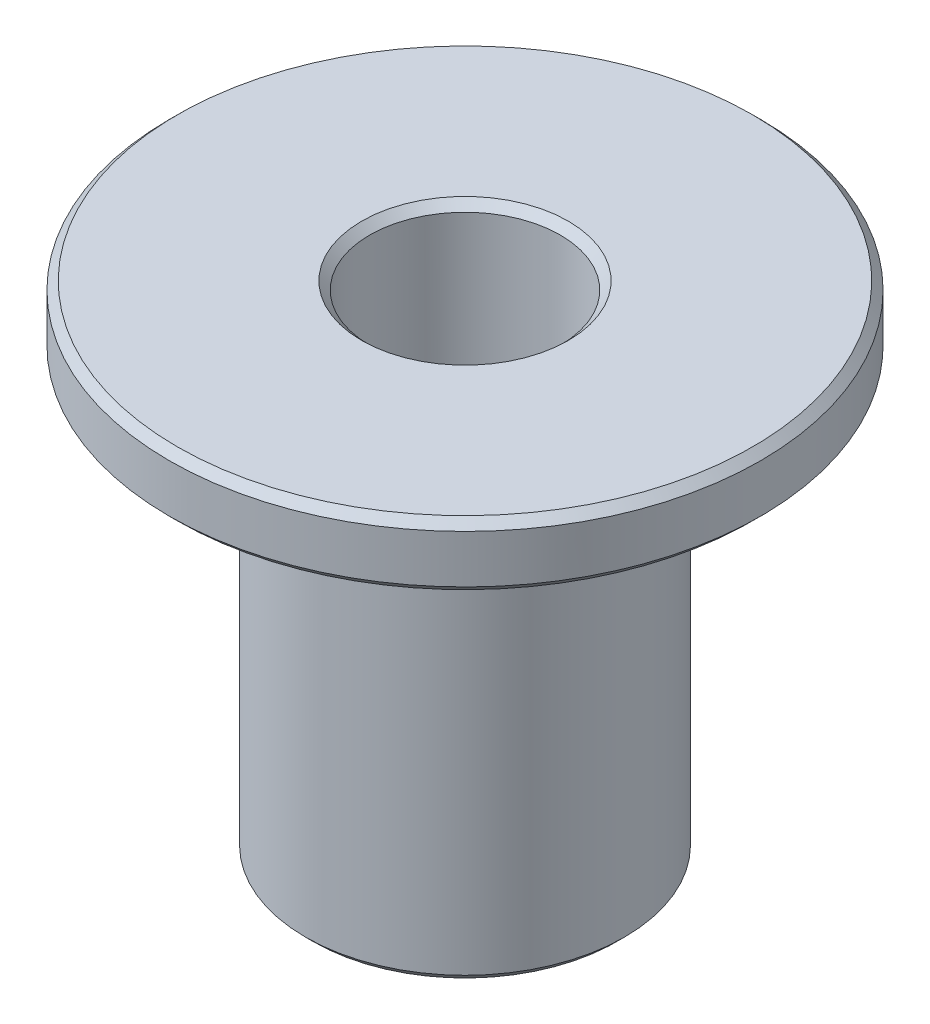
ISO-10303-21;
HEADER;
FILE_DESCRIPTION(('STEP AP214'),'2;1');
FILE_NAME('part.step','',(''),(''),'','','');
FILE_SCHEMA(('AUTOMOTIVE_DESIGN { 1 0 10303 214 1 1 1 1 }'));
ENDSEC;
DATA;
#1=APPLICATION_CONTEXT('core data for automotive mechanical design processes');
#2=APPLICATION_PROTOCOL_DEFINITION('international standard','automotive_design',2000,#1);
#3=PRODUCT_CONTEXT('',#1,'mechanical');
#4=PRODUCT('Part','Part','',(#3));
#5=PRODUCT_RELATED_PRODUCT_CATEGORY('part','',(#4));
#6=PRODUCT_DEFINITION_FORMATION('','',#4);
#7=PRODUCT_DEFINITION_CONTEXT('part definition',#1,'design');
#8=PRODUCT_DEFINITION('design','',#6,#7);
#9=PRODUCT_DEFINITION_SHAPE('','',#8);
#10=(LENGTH_UNIT() NAMED_UNIT(*) SI_UNIT(.MILLI.,.METRE.));
#11=(NAMED_UNIT(*) PLANE_ANGLE_UNIT() SI_UNIT($,.RADIAN.));
#12=(NAMED_UNIT(*) SI_UNIT($,.STERADIAN.) SOLID_ANGLE_UNIT());
#13=UNCERTAINTY_MEASURE_WITH_UNIT(LENGTH_MEASURE(1.E-05),#10,'distance_accuracy_value','');
#14=(GEOMETRIC_REPRESENTATION_CONTEXT(3) GLOBAL_UNCERTAINTY_ASSIGNED_CONTEXT((#13)) GLOBAL_UNIT_ASSIGNED_CONTEXT((#10,
#11,#12)) REPRESENTATION_CONTEXT('',''));
#15=CARTESIAN_POINT('',(0.,0.,0.));
#16=DIRECTION('',(0.,0.,1.));
#17=DIRECTION('',(1.,0.,0.));
#18=AXIS2_PLACEMENT_3D('',#15,#16,#17);
#19=CARTESIAN_POINT('',(4.975,14.5,0.));
#20=DIRECTION('',(0.,1.,0.));
#21=DIRECTION('',(0.,0.,1.));
#22=AXIS2_PLACEMENT_3D('',#19,#20,#21);
#23=PLANE('',#22);
#24=CARTESIAN_POINT('',(0.,14.5,0.));
#25=DIRECTION('',(0.,1.,0.));
#26=DIRECTION('',(0.,0.,1.));
#27=AXIS2_PLACEMENT_3D('',#24,#25,#26);
#28=CIRCLE('',#27,3.225);
#29=CARTESIAN_POINT('',(0.,14.5,3.225));
#30=VERTEX_POINT('',#29);
#31=EDGE_CURVE('E62',#30,#30,#28,.T.);
#32=ORIENTED_EDGE('',*,*,#31,.T.);
#33=EDGE_LOOP('',(#32));
#34=FACE_BOUND('',#33,.T.);
#35=CARTESIAN_POINT('',(0.,14.5,0.));
#36=DIRECTION('',(0.,1.,0.));
#37=DIRECTION('',(0.,0.,1.));
#38=AXIS2_PLACEMENT_3D('',#35,#36,#37);
#39=CIRCLE('',#38,4.725);
#40=CARTESIAN_POINT('',(0.,14.5,4.725));
#41=VERTEX_POINT('',#40);
#42=EDGE_CURVE('E65',#41,#41,#39,.F.);
#43=ORIENTED_EDGE('',*,*,#42,.T.);
#44=EDGE_LOOP('',(#43));
#45=FACE_BOUND('',#44,.T.);
#46=ADVANCED_FACE('F31',(#34,#45),#23,.F.);
#47=CARTESIAN_POINT('',(0.,30.,0.));
#48=DIRECTION('',(0.,1.,0.));
#49=DIRECTION('',(0.,0.,1.));
#50=AXIS2_PLACEMENT_3D('',#47,#48,#49);
#51=CYLINDRICAL_SURFACE('',#50,2.975);
#52=CARTESIAN_POINT('',(0.,14.75,0.));
#53=DIRECTION('',(0.,1.,0.));
#54=DIRECTION('',(0.,0.,1.));
#55=AXIS2_PLACEMENT_3D('',#52,#53,#54);
#56=CIRCLE('',#55,2.975);
#57=CARTESIAN_POINT('',(0.,14.75,2.975));
#58=VERTEX_POINT('',#57);
#59=EDGE_CURVE('E56',#58,#58,#56,.F.);
#60=ORIENTED_EDGE('',*,*,#59,.T.);
#61=EDGE_LOOP('',(#60));
#62=FACE_BOUND('',#61,.T.);
#63=CARTESIAN_POINT('',(0.,29.75,0.));
#64=DIRECTION('',(0.,-1.,0.));
#65=DIRECTION('',(0.,0.,-1.));
#66=AXIS2_PLACEMENT_3D('',#63,#64,#65);
#67=CIRCLE('',#66,2.975);
#68=CARTESIAN_POINT('',(0.,29.75,-2.975));
#69=VERTEX_POINT('',#68);
#70=EDGE_CURVE('E59',#69,#69,#67,.F.);
#71=ORIENTED_EDGE('',*,*,#70,.T.);
#72=EDGE_LOOP('',(#71));
#73=FACE_BOUND('',#72,.T.);
#74=ADVANCED_FACE('F88',(#62,#73),#51,.F.);
#75=CARTESIAN_POINT('',(2.975,30.,0.));
#76=DIRECTION('',(0.,-1.,0.));
#77=DIRECTION('',(0.,0.,-1.));
#78=AXIS2_PLACEMENT_3D('',#75,#76,#77);
#79=PLANE('',#78);
#80=CARTESIAN_POINT('',(0.,30.,0.));
#81=DIRECTION('',(0.,-1.,0.));
#82=DIRECTION('',(0.,0.,-1.));
#83=AXIS2_PLACEMENT_3D('',#80,#81,#82);
#84=CIRCLE('',#83,3.225);
#85=CARTESIAN_POINT('',(0.,30.,-3.225));
#86=VERTEX_POINT('',#85);
#87=EDGE_CURVE('E50',#86,#86,#84,.T.);
#88=ORIENTED_EDGE('',*,*,#87,.T.);
#89=EDGE_LOOP('',(#88));
#90=FACE_BOUND('',#89,.T.);
#91=CARTESIAN_POINT('',(0.,30.,0.));
#92=DIRECTION('',(0.,-1.,0.));
#93=DIRECTION('',(0.,0.,-1.));
#94=AXIS2_PLACEMENT_3D('',#91,#92,#93);
#95=CIRCLE('',#94,8.975);
#96=CARTESIAN_POINT('',(0.,30.,-8.975));
#97=VERTEX_POINT('',#96);
#98=EDGE_CURVE('E53',#97,#97,#95,.F.);
#99=ORIENTED_EDGE('',*,*,#98,.T.);
#100=EDGE_LOOP('',(#99));
#101=FACE_BOUND('',#100,.T.);
#102=ADVANCED_FACE('F93',(#90,#101),#79,.F.);
#103=CARTESIAN_POINT('',(0.,30.,0.));
#104=DIRECTION('',(0.,1.,0.));
#105=DIRECTION('',(0.,0.,1.));
#106=AXIS2_PLACEMENT_3D('',#103,#104,#105);
#107=CYLINDRICAL_SURFACE('',#106,9.225);
#108=CARTESIAN_POINT('',(0.,29.75,0.));
#109=DIRECTION('',(0.,-1.,0.));
#110=DIRECTION('',(0.,0.,-1.));
#111=AXIS2_PLACEMENT_3D('',#108,#109,#110);
#112=CIRCLE('',#111,9.225);
#113=CARTESIAN_POINT('',(0.,29.75,-9.225));
#114=VERTEX_POINT('',#113);
#115=EDGE_CURVE('E41',#114,#114,#112,.T.);
#116=ORIENTED_EDGE('',*,*,#115,.T.);
#117=EDGE_LOOP('',(#116));
#118=FACE_BOUND('',#117,.T.);
#119=CARTESIAN_POINT('',(0.,28.25,0.));
#120=DIRECTION('',(0.,1.,0.));
#121=DIRECTION('',(0.,0.,1.));
#122=AXIS2_PLACEMENT_3D('',#119,#120,#121);
#123=CIRCLE('',#122,9.225);
#124=CARTESIAN_POINT('',(0.,28.25,9.225));
#125=VERTEX_POINT('',#124);
#126=EDGE_CURVE('E45',#125,#125,#123,.T.);
#127=ORIENTED_EDGE('',*,*,#126,.T.);
#128=EDGE_LOOP('',(#127));
#129=FACE_BOUND('',#128,.T.);
#130=ADVANCED_FACE('F85',(#118,#129),#107,.T.);
#131=CARTESIAN_POINT('',(9.225,28.,0.));
#132=DIRECTION('',(0.,1.,0.));
#133=DIRECTION('',(0.,0.,1.));
#134=AXIS2_PLACEMENT_3D('',#131,#132,#133);
#135=PLANE('',#134);
#136=CARTESIAN_POINT('',(0.,28.,0.));
#137=DIRECTION('',(0.,1.,0.));
#138=DIRECTION('',(0.,0.,1.));
#139=AXIS2_PLACEMENT_3D('',#136,#137,#138);
#140=CIRCLE('',#139,8.975);
#141=CARTESIAN_POINT('',(0.,28.,8.975));
#142=VERTEX_POINT('',#141);
#143=EDGE_CURVE('E37',#142,#142,#140,.F.);
#144=ORIENTED_EDGE('',*,*,#143,.T.);
#145=EDGE_LOOP('',(#144));
#146=FACE_BOUND('',#145,.T.);
#147=CARTESIAN_POINT('',(0.,28.,0.));
#148=DIRECTION('',(0.,1.,0.));
#149=DIRECTION('',(0.,0.,1.));
#150=AXIS2_PLACEMENT_3D('',#147,#148,#149);
#151=CIRCLE('',#150,4.975);
#152=CARTESIAN_POINT('',(0.,28.,4.975));
#153=VERTEX_POINT('',#152);
#154=EDGE_CURVE('E68',#153,#153,#151,.T.);
#155=ORIENTED_EDGE('',*,*,#154,.T.);
#156=EDGE_LOOP('',(#155));
#157=FACE_BOUND('',#156,.T.);
#158=ADVANCED_FACE('F72',(#146,#157),#135,.F.);
#159=CARTESIAN_POINT('',(0.,30.,0.));
#160=DIRECTION('',(0.,1.,0.));
#161=DIRECTION('',(0.,0.,1.));
#162=AXIS2_PLACEMENT_3D('',#159,#160,#161);
#163=CYLINDRICAL_SURFACE('',#162,4.975);
#164=CARTESIAN_POINT('',(0.,14.75,0.));
#165=DIRECTION('',(0.,1.,0.));
#166=DIRECTION('',(0.,0.,1.));
#167=AXIS2_PLACEMENT_3D('',#164,#165,#166);
#168=CIRCLE('',#167,4.975);
#169=CARTESIAN_POINT('',(0.,14.75,4.975));
#170=VERTEX_POINT('',#169);
#171=EDGE_CURVE('E10',#170,#170,#168,.T.);
#172=ORIENTED_EDGE('',*,*,#171,.T.);
#173=EDGE_LOOP('',(#172));
#174=FACE_BOUND('',#173,.T.);
#175=ORIENTED_EDGE('',*,*,#154,.F.);
#176=EDGE_LOOP('',(#175));
#177=FACE_BOUND('',#176,.T.);
#178=ADVANCED_FACE('F74',(#174,#177),#163,.T.);
#179=CARTESIAN_POINT('',(0.,14.5,0.));
#180=DIRECTION('',(0.,-1.,0.));
#181=DIRECTION('',(0.,0.,-1.));
#182=AXIS2_PLACEMENT_3D('',#179,#180,#181);
#183=CONICAL_SURFACE('',#182,3.225,0.785398163397453);
#184=ORIENTED_EDGE('',*,*,#59,.F.);
#185=EDGE_LOOP('',(#184));
#186=FACE_BOUND('',#185,.T.);
#187=ORIENTED_EDGE('',*,*,#31,.F.);
#188=EDGE_LOOP('',(#187));
#189=FACE_BOUND('',#188,.T.);
#190=ADVANCED_FACE('F76',(#186,#189),#183,.F.);
#191=CARTESIAN_POINT('',(0.,29.75,0.));
#192=DIRECTION('',(0.,1.,0.));
#193=DIRECTION('',(0.,0.,1.));
#194=AXIS2_PLACEMENT_3D('',#191,#192,#193);
#195=CONICAL_SURFACE('',#194,2.975,0.785398163397445);
#196=ORIENTED_EDGE('',*,*,#87,.F.);
#197=EDGE_LOOP('',(#196));
#198=FACE_BOUND('',#197,.T.);
#199=ORIENTED_EDGE('',*,*,#70,.F.);
#200=EDGE_LOOP('',(#199));
#201=FACE_BOUND('',#200,.T.);
#202=ADVANCED_FACE('F82',(#198,#201),#195,.F.);
#203=CARTESIAN_POINT('',(0.,30.,0.));
#204=DIRECTION('',(0.,-1.,0.));
#205=DIRECTION('',(0.,0.,-1.));
#206=AXIS2_PLACEMENT_3D('',#203,#204,#205);
#207=CONICAL_SURFACE('',#206,8.975,0.785398163397455);
#208=ORIENTED_EDGE('',*,*,#115,.F.);
#209=EDGE_LOOP('',(#208));
#210=FACE_BOUND('',#209,.T.);
#211=ORIENTED_EDGE('',*,*,#98,.F.);
#212=EDGE_LOOP('',(#211));
#213=FACE_BOUND('',#212,.T.);
#214=ADVANCED_FACE('F107',(#210,#213),#207,.T.);
#215=CARTESIAN_POINT('',(0.,28.25,0.));
#216=DIRECTION('',(0.,1.,0.));
#217=DIRECTION('',(0.,0.,1.));
#218=AXIS2_PLACEMENT_3D('',#215,#216,#217);
#219=CONICAL_SURFACE('',#218,9.225,0.785398163397445);
#220=ORIENTED_EDGE('',*,*,#143,.F.);
#221=EDGE_LOOP('',(#220));
#222=FACE_BOUND('',#221,.T.);
#223=ORIENTED_EDGE('',*,*,#126,.F.);
#224=EDGE_LOOP('',(#223));
#225=FACE_BOUND('',#224,.T.);
#226=ADVANCED_FACE('F102',(#222,#225),#219,.T.);
#227=CARTESIAN_POINT('',(0.,14.75,0.));
#228=DIRECTION('',(0.,1.,0.));
#229=DIRECTION('',(0.,0.,1.));
#230=AXIS2_PLACEMENT_3D('',#227,#228,#229);
#231=CONICAL_SURFACE('',#230,4.975,0.785398163397445);
#232=ORIENTED_EDGE('',*,*,#42,.F.);
#233=EDGE_LOOP('',(#232));
#234=FACE_BOUND('',#233,.T.);
#235=ORIENTED_EDGE('',*,*,#171,.F.);
#236=EDGE_LOOP('',(#235));
#237=FACE_BOUND('',#236,.T.);
#238=ADVANCED_FACE('F99',(#234,#237),#231,.T.);
#239=CLOSED_SHELL('',(#46,#74,#102,#130,#158,#178,#190,#202,#214,#226,#238));
#240=MANIFOLD_SOLID_BREP('B2',#239);
#241=ADVANCED_BREP_SHAPE_REPRESENTATION('',(#18,#240),#14);
#242=SHAPE_DEFINITION_REPRESENTATION(#9,#241);
ENDSEC;
END-ISO-10303-21;
